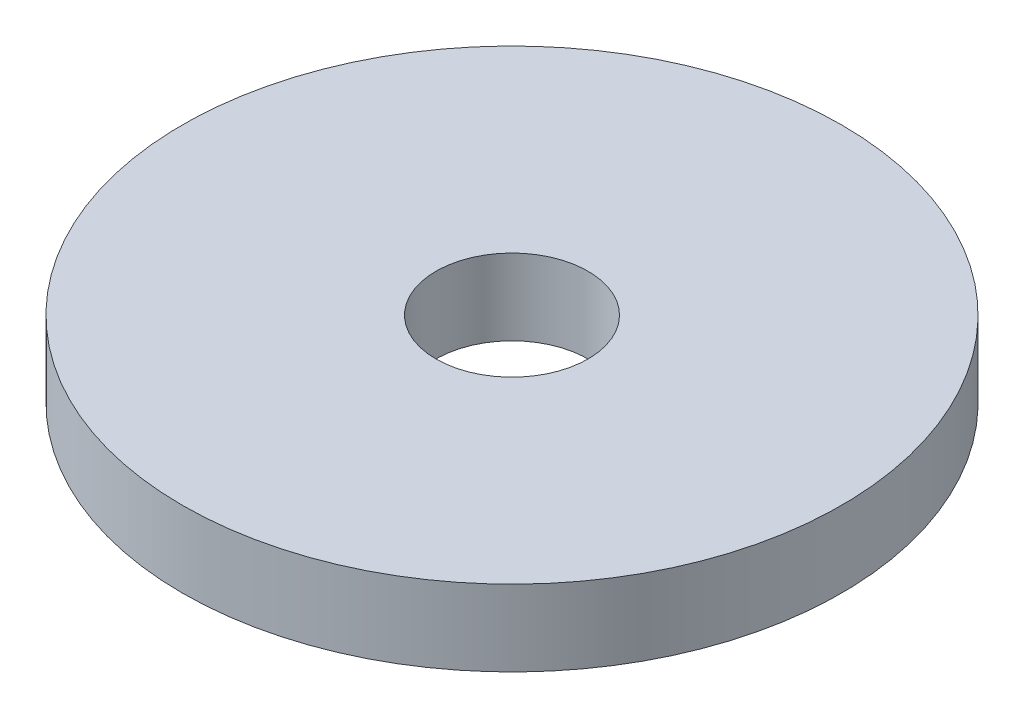
ISO-10303-21;
HEADER;
FILE_DESCRIPTION(('STEP AP214'),'2;1');
FILE_NAME('part.step','',(''),(''),'','','');
FILE_SCHEMA(('AUTOMOTIVE_DESIGN { 1 0 10303 214 1 1 1 1 }'));
ENDSEC;
DATA;
#1=APPLICATION_CONTEXT('core data for automotive mechanical design processes');
#2=APPLICATION_PROTOCOL_DEFINITION('international standard','automotive_design',2000,#1);
#3=PRODUCT_CONTEXT('',#1,'mechanical');
#4=PRODUCT('Part','Part','',(#3));
#5=PRODUCT_RELATED_PRODUCT_CATEGORY('part','',(#4));
#6=PRODUCT_DEFINITION_FORMATION('','',#4);
#7=PRODUCT_DEFINITION_CONTEXT('part definition',#1,'design');
#8=PRODUCT_DEFINITION('design','',#6,#7);
#9=PRODUCT_DEFINITION_SHAPE('','',#8);
#10=(LENGTH_UNIT() NAMED_UNIT(*) SI_UNIT(.MILLI.,.METRE.));
#11=(NAMED_UNIT(*) PLANE_ANGLE_UNIT() SI_UNIT($,.RADIAN.));
#12=(NAMED_UNIT(*) SI_UNIT($,.STERADIAN.) SOLID_ANGLE_UNIT());
#13=UNCERTAINTY_MEASURE_WITH_UNIT(LENGTH_MEASURE(1.E-05),#10,'distance_accuracy_value','');
#14=(GEOMETRIC_REPRESENTATION_CONTEXT(3) GLOBAL_UNCERTAINTY_ASSIGNED_CONTEXT((#13)) GLOBAL_UNIT_ASSIGNED_CONTEXT((#10,
#11,#12)) REPRESENTATION_CONTEXT('',''));
#15=CARTESIAN_POINT('',(0.,0.,0.));
#16=DIRECTION('',(0.,0.,1.));
#17=DIRECTION('',(1.,0.,0.));
#18=AXIS2_PLACEMENT_3D('',#15,#16,#17);
#19=CARTESIAN_POINT('',(0.,3.,0.));
#20=DIRECTION('',(0.,1.,0.));
#21=DIRECTION('',(0.,0.,1.));
#22=AXIS2_PLACEMENT_3D('',#19,#20,#21);
#23=PLANE('',#22);
#24=CARTESIAN_POINT('',(0.,3.,0.));
#25=DIRECTION('',(0.,1.,0.));
#26=DIRECTION('',(0.,0.,1.));
#27=AXIS2_PLACEMENT_3D('',#24,#25,#26);
#28=CIRCLE('',#27,13.);
#29=CARTESIAN_POINT('',(0.,3.,13.));
#30=VERTEX_POINT('',#29);
#31=EDGE_CURVE('E10',#30,#30,#28,.T.);
#32=ORIENTED_EDGE('',*,*,#31,.T.);
#33=EDGE_LOOP('',(#32));
#34=FACE_BOUND('',#33,.T.);
#35=CARTESIAN_POINT('',(0.,3.,0.));
#36=DIRECTION('',(0.,1.,0.));
#37=DIRECTION('',(0.,0.,1.));
#38=AXIS2_PLACEMENT_3D('',#35,#36,#37);
#39=CIRCLE('',#38,3.);
#40=CARTESIAN_POINT('',(0.,3.,3.));
#41=VERTEX_POINT('',#40);
#42=EDGE_CURVE('E52',#41,#41,#39,.T.);
#43=ORIENTED_EDGE('',*,*,#42,.F.);
#44=EDGE_LOOP('',(#43));
#45=FACE_BOUND('',#44,.T.);
#46=ADVANCED_FACE('F39',(#34,#45),#23,.T.);
#47=CARTESIAN_POINT('',(0.,0.,0.));
#48=DIRECTION('',(0.,1.,0.));
#49=DIRECTION('',(0.,0.,1.));
#50=AXIS2_PLACEMENT_3D('',#47,#48,#49);
#51=PLANE('',#50);
#52=CARTESIAN_POINT('',(0.,0.,0.));
#53=DIRECTION('',(0.,1.,0.));
#54=DIRECTION('',(0.,0.,1.));
#55=AXIS2_PLACEMENT_3D('',#52,#53,#54);
#56=CIRCLE('',#55,13.);
#57=CARTESIAN_POINT('',(0.,0.,13.));
#58=VERTEX_POINT('',#57);
#59=EDGE_CURVE('E43',#58,#58,#56,.T.);
#60=ORIENTED_EDGE('',*,*,#59,.F.);
#61=EDGE_LOOP('',(#60));
#62=FACE_BOUND('',#61,.T.);
#63=CARTESIAN_POINT('',(0.,0.,0.));
#64=DIRECTION('',(0.,1.,0.));
#65=DIRECTION('',(0.,0.,1.));
#66=AXIS2_PLACEMENT_3D('',#63,#64,#65);
#67=CIRCLE('',#66,3.);
#68=CARTESIAN_POINT('',(0.,0.,3.));
#69=VERTEX_POINT('',#68);
#70=EDGE_CURVE('E54',#69,#69,#67,.T.);
#71=ORIENTED_EDGE('',*,*,#70,.T.);
#72=EDGE_LOOP('',(#71));
#73=FACE_BOUND('',#72,.T.);
#74=ADVANCED_FACE('F66',(#62,#73),#51,.F.);
#75=CARTESIAN_POINT('',(0.,3.,0.));
#76=DIRECTION('',(0.,-1.,0.));
#77=DIRECTION('',(0.,0.,-1.));
#78=AXIS2_PLACEMENT_3D('',#75,#76,#77);
#79=CYLINDRICAL_SURFACE('',#78,13.);
#80=ORIENTED_EDGE('',*,*,#31,.F.);
#81=EDGE_LOOP('',(#80));
#82=FACE_BOUND('',#81,.T.);
#83=ORIENTED_EDGE('',*,*,#59,.T.);
#84=EDGE_LOOP('',(#83));
#85=FACE_BOUND('',#84,.T.);
#86=ADVANCED_FACE('F41',(#82,#85),#79,.T.);
#87=CARTESIAN_POINT('',(0.,3.,0.));
#88=DIRECTION('',(0.,-1.,0.));
#89=DIRECTION('',(0.,0.,-1.));
#90=AXIS2_PLACEMENT_3D('',#87,#88,#89);
#91=CYLINDRICAL_SURFACE('',#90,3.);
#92=ORIENTED_EDGE('',*,*,#42,.T.);
#93=EDGE_LOOP('',(#92));
#94=FACE_BOUND('',#93,.T.);
#95=ORIENTED_EDGE('',*,*,#70,.F.);
#96=EDGE_LOOP('',(#95));
#97=FACE_BOUND('',#96,.T.);
#98=ADVANCED_FACE('F62',(#94,#97),#91,.F.);
#99=CLOSED_SHELL('',(#46,#74,#86,#98));
#100=MANIFOLD_SOLID_BREP('B2',#99);
#101=ADVANCED_BREP_SHAPE_REPRESENTATION('',(#18,#100),#14);
#102=SHAPE_DEFINITION_REPRESENTATION(#9,#101);
ENDSEC;
END-ISO-10303-21;
